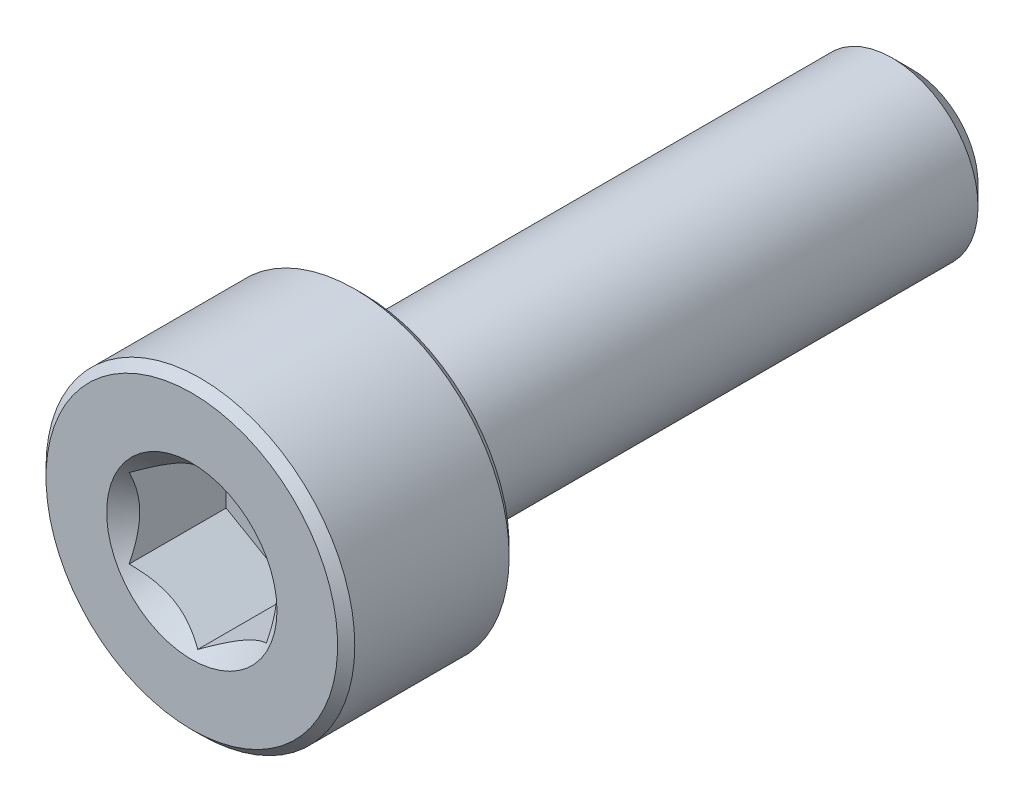
ISO-10303-21;
HEADER;
FILE_DESCRIPTION(('STEP AP214'),'2;1');
FILE_NAME('part.step','',(''),(''),'','','');
FILE_SCHEMA(('AUTOMOTIVE_DESIGN { 1 0 10303 214 1 1 1 1 }'));
ENDSEC;
DATA;
#1=APPLICATION_CONTEXT('core data for automotive mechanical design processes');
#2=APPLICATION_PROTOCOL_DEFINITION('international standard','automotive_design',2000,#1);
#3=PRODUCT_CONTEXT('',#1,'mechanical');
#4=PRODUCT('Part','Part','',(#3));
#5=PRODUCT_RELATED_PRODUCT_CATEGORY('part','',(#4));
#6=PRODUCT_DEFINITION_FORMATION('','',#4);
#7=PRODUCT_DEFINITION_CONTEXT('part definition',#1,'design');
#8=PRODUCT_DEFINITION('design','',#6,#7);
#9=PRODUCT_DEFINITION_SHAPE('','',#8);
#10=(LENGTH_UNIT() NAMED_UNIT(*) SI_UNIT(.MILLI.,.METRE.));
#11=(NAMED_UNIT(*) PLANE_ANGLE_UNIT() SI_UNIT($,.RADIAN.));
#12=(NAMED_UNIT(*) SI_UNIT($,.STERADIAN.) SOLID_ANGLE_UNIT());
#13=UNCERTAINTY_MEASURE_WITH_UNIT(LENGTH_MEASURE(1.E-05),#10,'distance_accuracy_value','');
#14=(GEOMETRIC_REPRESENTATION_CONTEXT(3) GLOBAL_UNCERTAINTY_ASSIGNED_CONTEXT((#13)) GLOBAL_UNIT_ASSIGNED_CONTEXT((#10,
#11,#12)) REPRESENTATION_CONTEXT('',''));
#15=CARTESIAN_POINT('',(0.,0.,0.));
#16=DIRECTION('',(0.,0.,1.));
#17=DIRECTION('',(1.,0.,0.));
#18=AXIS2_PLACEMENT_3D('',#15,#16,#17);
#19=CARTESIAN_POINT('',(0.,0.,2.625));
#20=DIRECTION('',(0.,0.,-1.));
#21=DIRECTION('',(0.,1.,0.));
#22=AXIS2_PLACEMENT_3D('',#19,#20,#21);
#23=TOROIDAL_SURFACE('',#22,1.375,0.125);
#24=CARTESIAN_POINT('',(0.,0.,2.75));
#25=DIRECTION('',(0.,0.,-1.));
#26=DIRECTION('',(0.,1.,0.));
#27=AXIS2_PLACEMENT_3D('',#24,#25,#26);
#28=CIRCLE('',#27,1.375);
#29=CARTESIAN_POINT('',(0.,1.375,2.75));
#30=VERTEX_POINT('',#29);
#31=EDGE_CURVE('E247',#30,#30,#28,.T.);
#32=ORIENTED_EDGE('',*,*,#31,.T.);
#33=EDGE_LOOP('',(#32));
#34=FACE_BOUND('',#33,.T.);
#35=CARTESIAN_POINT('',(0.,0.,2.625));
#36=DIRECTION('',(0.,0.,-1.));
#37=DIRECTION('',(0.,1.,0.));
#38=AXIS2_PLACEMENT_3D('',#35,#36,#37);
#39=CIRCLE('',#38,1.25);
#40=CARTESIAN_POINT('',(0.,1.25,2.625));
#41=VERTEX_POINT('',#40);
#42=EDGE_CURVE('E55',#41,#41,#39,.T.);
#43=ORIENTED_EDGE('',*,*,#42,.F.);
#44=EDGE_LOOP('',(#43));
#45=FACE_BOUND('',#44,.T.);
#46=ADVANCED_FACE('F50',(#34,#45),#23,.F.);
#47=CARTESIAN_POINT('',(0.,2.125,2.75));
#48=DIRECTION('',(0.,0.,-1.));
#49=DIRECTION('',(0.,1.,0.));
#50=AXIS2_PLACEMENT_3D('',#47,#48,#49);
#51=PLANE('',#50);
#52=CARTESIAN_POINT('',(0.,0.,2.75));
#53=DIRECTION('',(0.,0.,-1.));
#54=DIRECTION('',(0.,1.,0.));
#55=AXIS2_PLACEMENT_3D('',#52,#53,#54);
#56=CIRCLE('',#55,2.125);
#57=CARTESIAN_POINT('',(0.,2.125,2.75));
#58=VERTEX_POINT('',#57);
#59=EDGE_CURVE('E249',#58,#58,#56,.T.);
#60=ORIENTED_EDGE('',*,*,#59,.T.);
#61=EDGE_LOOP('',(#60));
#62=FACE_BOUND('',#61,.T.);
#63=ORIENTED_EDGE('',*,*,#31,.F.);
#64=EDGE_LOOP('',(#63));
#65=FACE_BOUND('',#64,.T.);
#66=ADVANCED_FACE('F117',(#62,#65),#51,.T.);
#67=CARTESIAN_POINT('',(0.,0.,2.75));
#68=DIRECTION('',(0.,0.,1.));
#69=DIRECTION('',(0.,-1.,0.));
#70=AXIS2_PLACEMENT_3D('',#67,#68,#69);
#71=CONICAL_SURFACE('',#70,2.125,0.78539816339745);
#72=CARTESIAN_POINT('',(0.,0.,2.875));
#73=DIRECTION('',(0.,0.,-1.));
#74=DIRECTION('',(0.,1.,0.));
#75=AXIS2_PLACEMENT_3D('',#72,#73,#74);
#76=CIRCLE('',#75,2.25);
#77=CARTESIAN_POINT('',(0.,2.25,2.875));
#78=VERTEX_POINT('',#77);
#79=EDGE_CURVE('E258',#78,#78,#76,.T.);
#80=ORIENTED_EDGE('',*,*,#79,.T.);
#81=EDGE_LOOP('',(#80));
#82=FACE_BOUND('',#81,.T.);
#83=ORIENTED_EDGE('',*,*,#59,.F.);
#84=EDGE_LOOP('',(#83));
#85=FACE_BOUND('',#84,.T.);
#86=ADVANCED_FACE('F122',(#82,#85),#71,.T.);
#87=CARTESIAN_POINT('',(0.,0.,-5.25));
#88=DIRECTION('',(0.,0.,-1.));
#89=DIRECTION('',(0.,1.,0.));
#90=AXIS2_PLACEMENT_3D('',#87,#88,#89);
#91=CYLINDRICAL_SURFACE('',#90,2.25);
#92=CARTESIAN_POINT('',(0.,0.,5.125));
#93=DIRECTION('',(0.,0.,-1.));
#94=DIRECTION('',(0.,1.,0.));
#95=AXIS2_PLACEMENT_3D('',#92,#93,#94);
#96=CIRCLE('',#95,2.25);
#97=CARTESIAN_POINT('',(0.,2.25,5.125));
#98=VERTEX_POINT('',#97);
#99=EDGE_CURVE('E237',#98,#98,#96,.T.);
#100=ORIENTED_EDGE('',*,*,#99,.T.);
#101=EDGE_LOOP('',(#100));
#102=FACE_BOUND('',#101,.T.);
#103=ORIENTED_EDGE('',*,*,#79,.F.);
#104=EDGE_LOOP('',(#103));
#105=FACE_BOUND('',#104,.T.);
#106=ADVANCED_FACE('F130',(#102,#105),#91,.T.);
#107=CARTESIAN_POINT('',(0.,0.,5.125));
#108=DIRECTION('',(0.,0.,-1.));
#109=DIRECTION('',(0.,1.,0.));
#110=AXIS2_PLACEMENT_3D('',#107,#108,#109);
#111=CONICAL_SURFACE('',#110,2.25,0.78539816339745);
#112=CARTESIAN_POINT('',(0.,0.,5.25));
#113=DIRECTION('',(0.,0.,-1.));
#114=DIRECTION('',(0.,1.,0.));
#115=AXIS2_PLACEMENT_3D('',#112,#113,#114);
#116=CIRCLE('',#115,2.125);
#117=CARTESIAN_POINT('',(0.,2.125,5.25));
#118=VERTEX_POINT('',#117);
#119=EDGE_CURVE('E234',#118,#118,#116,.T.);
#120=ORIENTED_EDGE('',*,*,#119,.T.);
#121=EDGE_LOOP('',(#120));
#122=FACE_BOUND('',#121,.T.);
#123=ORIENTED_EDGE('',*,*,#99,.F.);
#124=EDGE_LOOP('',(#123));
#125=FACE_BOUND('',#124,.T.);
#126=ADVANCED_FACE('F134',(#122,#125),#111,.T.);
#127=CARTESIAN_POINT('',(0.,0.,5.25));
#128=DIRECTION('',(0.,0.,1.));
#129=DIRECTION('',(0.,-1.,0.));
#130=AXIS2_PLACEMENT_3D('',#127,#128,#129);
#131=PLANE('',#130);
#132=CARTESIAN_POINT('',(0.,0.,5.25));
#133=DIRECTION('',(0.,0.,1.));
#134=DIRECTION('',(1.,0.,0.));
#135=AXIS2_PLACEMENT_3D('',#132,#133,#134);
#136=CIRCLE('',#135,1.2413030787577);
#137=CARTESIAN_POINT('',(1.2413030787577,0.,5.25));
#138=VERTEX_POINT('',#137);
#139=EDGE_CURVE('E12',#138,#138,#136,.T.);
#140=ORIENTED_EDGE('',*,*,#139,.F.);
#141=EDGE_LOOP('',(#140));
#142=FACE_BOUND('',#141,.T.);
#143=ORIENTED_EDGE('',*,*,#119,.F.);
#144=EDGE_LOOP('',(#143));
#145=FACE_BOUND('',#144,.T.);
#146=ADVANCED_FACE('F138',(#142,#145),#131,.T.);
#147=CARTESIAN_POINT('',(0.,0.,5.25));
#148=DIRECTION('',(0.,0.,1.));
#149=DIRECTION('',(1.,0.,0.));
#150=AXIS2_PLACEMENT_3D('',#147,#148,#149);
#151=CONICAL_SURFACE('',#150,1.2413030787577,0.78539816339745);
#152=ORIENTED_EDGE('',*,*,#139,.T.);
#153=EDGE_LOOP('',(#152));
#154=FACE_BOUND('',#153,.T.);
#155=CARTESIAN_POINT('',(-0.000199999999999619,-1.15481600843309,5.16351294699417));
#156=CARTESIAN_POINT('',(0.0341825950071808,-1.13496520795026,5.14367539044729));
#157=CARTESIAN_POINT('',(0.0691401181398248,-1.11478247255942,5.12500248026044));
#158=CARTESIAN_POINT('',(0.14042280295609,-1.07362739529219,5.09081220234471));
#159=CARTESIAN_POINT('',(0.176754750528984,-1.0526511355808,5.07531386864501));
#160=CARTESIAN_POINT('',(0.250016613803311,-1.01035337909803,5.04876476676382));
#161=CARTESIAN_POINT('',(0.286927851445415,-0.989042666109241,5.03764723361848));
#162=CARTESIAN_POINT('',(0.361562729310859,-0.945952199282691,5.02051732539774));
#163=CARTESIAN_POINT('',(0.399284088108636,-0.924173762626596,5.01449215708823));
#164=CARTESIAN_POINT('',(0.464292198417934,-0.886641312640014,5.00905801458905));
#165=CARTESIAN_POINT('',(0.491494371528172,-0.870936130672275,5.00825439793829));
#166=CARTESIAN_POINT('',(0.545846040669112,-0.839556179862848,5.00960415903844));
#167=CARTESIAN_POINT('',(0.572995523754876,-0.823881418494923,5.01175818916875));
#168=CARTESIAN_POINT('',(0.65405627732696,-0.777080970599367,5.02251443175003));
#169=CARTESIAN_POINT('',(0.707564140978428,-0.74618819111643,5.03541201603691));
#170=CARTESIAN_POINT('',(0.801476065143432,-0.691968116419649,5.06653819022373));
#171=CARTESIAN_POINT('',(0.842320523671835,-0.668386557293371,5.08313525732339));
#172=CARTESIAN_POINT('',(0.922409637381944,-0.622147085933681,5.12052238430685));
#173=CARTESIAN_POINT('',(0.961659010870438,-0.599486449584575,5.14129880143896));
#174=CARTESIAN_POINT('',(1.0002,-0.577234799135787,5.16351294699417));
#175=B_SPLINE_CURVE_WITH_KNOTS('',3,(#155,#156,#157,#158,#159,#160,#161,#162,#163,#164,#165,
#166,#167,#168,#169,#170,#171,#172,#173,#174),.UNSPECIFIED.,.F.,.F.,(4,2,2,2,2,2,2,2,2,4),(0.,
0.133237676828559,0.26725222983449,0.3991370762693,0.530689603280768,0.624814864263846,
0.718960890149133,0.907306626112097,1.05710100361789,1.20641411519286),.UNSPECIFIED.);
#176=CARTESIAN_POINT('',(0.,-1.15470053837925,5.16339745962156));
#177=VERTEX_POINT('',#176);
#178=CARTESIAN_POINT('',(1.,-0.577350269189626,5.16339745962156));
#179=VERTEX_POINT('',#178);
#180=EDGE_CURVE('E67',#177,#179,#175,.T.);
#181=ORIENTED_EDGE('',*,*,#180,.F.);
#182=CARTESIAN_POINT('',(-1.0002,-0.577234799135788,5.16351294699417));
#183=CARTESIAN_POINT('',(-0.965817404992819,-0.597085599618622,5.14367539044729));
#184=CARTESIAN_POINT('',(-0.930859881860175,-0.617268335009456,5.12500248026045));
#185=CARTESIAN_POINT('',(-0.85957719704391,-0.658423412276686,5.09081220234471));
#186=CARTESIAN_POINT('',(-0.823245249471016,-0.67939967198808,5.07531386864501));
#187=CARTESIAN_POINT('',(-0.749983386196689,-0.721697428470846,5.04876476676382));
#188=CARTESIAN_POINT('',(-0.713072148554585,-0.743008141459637,5.03764723361848));
#189=CARTESIAN_POINT('',(-0.638437270689141,-0.786098608286186,5.02051732539774));
#190=CARTESIAN_POINT('',(-0.600715911891364,-0.807877044942281,5.01449215708823));
#191=CARTESIAN_POINT('',(-0.535707801582066,-0.845409494928863,5.00905801458905));
#192=CARTESIAN_POINT('',(-0.508505628471827,-0.861114676896602,5.00825439793829));
#193=CARTESIAN_POINT('',(-0.454153959330887,-0.892494627706029,5.00960415903844));
#194=CARTESIAN_POINT('',(-0.427004476245124,-0.908169389073954,5.01175818916875));
#195=CARTESIAN_POINT('',(-0.345943722673039,-0.954969836969511,5.02251443175003));
#196=CARTESIAN_POINT('',(-0.292435859021572,-0.985862616452447,5.03541201603691));
#197=CARTESIAN_POINT('',(-0.198523934856568,-1.04008269114923,5.06653819022373));
#198=CARTESIAN_POINT('',(-0.157679476328165,-1.06366425027551,5.08313525732339));
#199=CARTESIAN_POINT('',(-0.0775903626180557,-1.1099037216352,5.12052238430685));
#200=CARTESIAN_POINT('',(-0.0383409891295617,-1.1325643579843,5.14129880143896));
#201=CARTESIAN_POINT('',(0.000200000000000583,-1.15481600843309,5.16351294699417));
#202=B_SPLINE_CURVE_WITH_KNOTS('',3,(#182,#183,#184,#185,#186,#187,#188,#189,#190,#191,#192,
#193,#194,#195,#196,#197,#198,#199,#200,#201),.UNSPECIFIED.,.F.,.F.,(4,2,2,2,2,2,2,2,2,4),(0.,
0.133237676828559,0.267252229834491,0.3991370762693,0.530689603280769,0.624814864263847,
0.718960890149134,0.907306626112098,1.05710100361789,1.20641411519286),.UNSPECIFIED.);
#203=CARTESIAN_POINT('',(-1.,-0.577350269189626,5.16339745962156));
#204=VERTEX_POINT('',#203);
#205=EDGE_CURVE('E60',#204,#177,#202,.T.);
#206=ORIENTED_EDGE('',*,*,#205,.F.);
#207=CARTESIAN_POINT('',(-1.,-1.21199087789934,5.57997725527287));
#208=CARTESIAN_POINT('',(-1.,-1.18273650300522,5.55741554693661));
#209=CARTESIAN_POINT('',(-1.,-1.15332592158341,5.53505703381193));
#210=CARTESIAN_POINT('',(-1.,-1.09412680336146,5.4908320719692));
#211=CARTESIAN_POINT('',(-1.,-1.06433818018075,5.46896573899681));
#212=CARTESIAN_POINT('',(-1.,-0.973871293541519,5.4039212875776));
#213=CARTESIAN_POINT('',(-1.,-0.912535008128867,5.3616436137258));
#214=CARTESIAN_POINT('',(-1.,-0.783508251342875,5.27806824785001));
#215=CARTESIAN_POINT('',(-1.,-0.715662620346606,5.23700761033256));
#216=CARTESIAN_POINT('',(-1.,-0.576509894905891,5.16150147066944));
#217=CARTESIAN_POINT('',(-1.,-0.505215555513882,5.12703362621591));
#218=CARTESIAN_POINT('',(-1.,-0.398764046939012,5.08484878246325));
#219=CARTESIAN_POINT('',(-1.,-0.365313297980422,5.07284938948254));
#220=CARTESIAN_POINT('',(-1.,-0.297551245132093,5.05153030995285));
#221=CARTESIAN_POINT('',(-1.,-0.263239887100777,5.04221079245894));
#222=CARTESIAN_POINT('',(-1.,-0.194571067470056,5.02691167587498));
#223=CARTESIAN_POINT('',(-1.,-0.160227555987668,5.02087048308474));
#224=CARTESIAN_POINT('',(-1.,-0.0910948269867767,5.01225224503757));
#225=CARTESIAN_POINT('',(-1.,-0.0563055613802757,5.009675576765));
#226=CARTESIAN_POINT('',(-1.,0.0117927152654021,5.00821295512037));
#227=CARTESIAN_POINT('',(-1.,0.0450983170825076,5.00916703835344));
#228=CARTESIAN_POINT('',(-1.,0.111441413420384,5.01434362211099));
#229=CARTESIAN_POINT('',(-1.,0.144478971732107,5.01856532046785));
#230=CARTESIAN_POINT('',(-1.,0.210624763290573,5.03010847896862));
#231=CARTESIAN_POINT('',(-1.,0.243723154740698,5.03748543479042));
#232=CARTESIAN_POINT('',(-1.,0.309187738497536,5.05492899920948));
#233=CARTESIAN_POINT('',(-1.,0.341553969590706,5.06499546496534));
#234=CARTESIAN_POINT('',(-1.,0.440875348086756,5.09974257065232));
#235=CARTESIAN_POINT('',(-1.,0.506480526276306,5.1282699754181));
#236=CARTESIAN_POINT('',(-1.,0.634628446237199,5.19175922476326));
#237=CARTESIAN_POINT('',(-1.,0.697159414671816,5.22674368431451));
#238=CARTESIAN_POINT('',(-1.,0.816694357126197,5.29898555821879));
#239=CARTESIAN_POINT('',(-1.,0.873818851530727,5.33604607035742));
#240=CARTESIAN_POINT('',(-1.,0.957979712513754,5.39336695643995));
#241=CARTESIAN_POINT('',(-1.,0.985671461150835,5.41268175945423));
#242=CARTESIAN_POINT('',(-1.,1.0406749612098,5.45182989264588));
#243=CARTESIAN_POINT('',(-1.,1.06798681474316,5.47166307919343));
#244=CARTESIAN_POINT('',(-1.,1.09514019811391,5.49171143685736));
#245=B_SPLINE_CURVE_WITH_KNOTS('',3,(#207,#208,#209,#210,#211,#212,#213,#214,#215,#216,#217,
#218,#219,#220,#221,#222,#223,#224,#225,#226,#227,#228,#229,#230,#231,#232,#233,#234,#235,#236,
#237,#238,#239,#240,#241,#242,#243,#244),.UNSPECIFIED.,.F.,.F.,(4,2,2,2,2,2,2,2,2,2,2,2,2,2,2,2,
2,2,4),(0.,0.110828944200308,0.221683685263867,0.445078388583645,0.682811068621037,
0.919723239940847,1.02624790401867,1.13277928653702,1.23723298361624,1.34169804566787,
1.44148938783186,1.54125623996228,1.64285505347063,1.74444847208079,1.95844200767913,
2.17319976124347,2.3773768581412,2.47865984803709,2.57991506662171),.UNSPECIFIED.);
#246=CARTESIAN_POINT('',(-1.,0.577350269189625,5.16339745962156));
#247=VERTEX_POINT('',#246);
#248=EDGE_CURVE('E176',#247,#204,#245,.F.);
#249=ORIENTED_EDGE('',*,*,#248,.F.);
#250=CARTESIAN_POINT('',(0.000199999999999743,1.15481600843309,5.16351294699417));
#251=CARTESIAN_POINT('',(-0.0341825950071808,1.13496520795026,5.14367539044729));
#252=CARTESIAN_POINT('',(-0.0691401181398251,1.11478247255942,5.12500248026044));
#253=CARTESIAN_POINT('',(-0.14042280295609,1.07362739529219,5.09081220234471));
#254=CARTESIAN_POINT('',(-0.176754750528985,1.0526511355808,5.07531386864501));
#255=CARTESIAN_POINT('',(-0.250016613803312,1.01035337909803,5.04876476676382));
#256=CARTESIAN_POINT('',(-0.286927851445415,0.989042666109241,5.03764723361848));
#257=CARTESIAN_POINT('',(-0.361562729310859,0.945952199282691,5.02051732539774));
#258=CARTESIAN_POINT('',(-0.399284088108636,0.924173762626596,5.01449215708823));
#259=CARTESIAN_POINT('',(-0.464292198417934,0.886641312640014,5.00905801458905));
#260=CARTESIAN_POINT('',(-0.491494371528172,0.870936130672275,5.00825439793829));
#261=CARTESIAN_POINT('',(-0.545846040669112,0.839556179862848,5.00960415903844));
#262=CARTESIAN_POINT('',(-0.572995523754876,0.823881418494924,5.01175818916875));
#263=CARTESIAN_POINT('',(-0.65405627732696,0.777080970599367,5.02251443175003));
#264=CARTESIAN_POINT('',(-0.707564140978427,0.74618819111643,5.03541201603691));
#265=CARTESIAN_POINT('',(-0.801476065143432,0.691968116419649,5.06653819022373));
#266=CARTESIAN_POINT('',(-0.842320523671834,0.668386557293371,5.08313525732339));
#267=CARTESIAN_POINT('',(-0.922409637381944,0.622147085933681,5.12052238430685));
#268=CARTESIAN_POINT('',(-0.961659010870438,0.599486449584575,5.14129880143896));
#269=CARTESIAN_POINT('',(-1.0002,0.577234799135788,5.16351294699417));
#270=B_SPLINE_CURVE_WITH_KNOTS('',3,(#250,#251,#252,#253,#254,#255,#256,#257,#258,#259,#260,
#261,#262,#263,#264,#265,#266,#267,#268,#269),.UNSPECIFIED.,.F.,.F.,(4,2,2,2,2,2,2,2,2,4),(0.,
0.13323767682856,0.267252229834491,0.399137076269301,0.530689603280768,0.624814864263846,
0.718960890149133,0.907306626112098,1.05710100361789,1.20641411519286),.UNSPECIFIED.);
#271=CARTESIAN_POINT('',(0.,1.15470053837925,5.16339745962156));
#272=VERTEX_POINT('',#271);
#273=EDGE_CURVE('E169',#272,#247,#270,.T.);
#274=ORIENTED_EDGE('',*,*,#273,.F.);
#275=CARTESIAN_POINT('',(1.0002,0.577234799135788,5.16351294699417));
#276=CARTESIAN_POINT('',(0.965817404992819,0.597085599618622,5.14367539044729));
#277=CARTESIAN_POINT('',(0.930859881860175,0.617268335009456,5.12500248026045));
#278=CARTESIAN_POINT('',(0.85957719704391,0.658423412276686,5.09081220234471));
#279=CARTESIAN_POINT('',(0.823245249471016,0.67939967198808,5.07531386864501));
#280=CARTESIAN_POINT('',(0.749983386196689,0.721697428470846,5.04876476676382));
#281=CARTESIAN_POINT('',(0.713072148554585,0.743008141459637,5.03764723361848));
#282=CARTESIAN_POINT('',(0.638437270689141,0.786098608286186,5.02051732539774));
#283=CARTESIAN_POINT('',(0.600715911891364,0.807877044942281,5.01449215708823));
#284=CARTESIAN_POINT('',(0.535707801582066,0.845409494928863,5.00905801458905));
#285=CARTESIAN_POINT('',(0.508505628471827,0.861114676896602,5.00825439793829));
#286=CARTESIAN_POINT('',(0.454153959330887,0.892494627706029,5.00960415903844));
#287=CARTESIAN_POINT('',(0.427004476245124,0.908169389073954,5.01175818916875));
#288=CARTESIAN_POINT('',(0.345943722673039,0.954969836969511,5.02251443175003));
#289=CARTESIAN_POINT('',(0.292435859021572,0.985862616452447,5.03541201603691));
#290=CARTESIAN_POINT('',(0.198523934856568,1.04008269114923,5.06653819022373));
#291=CARTESIAN_POINT('',(0.157679476328165,1.06366425027551,5.08313525732339));
#292=CARTESIAN_POINT('',(0.0775903626180557,1.1099037216352,5.12052238430685));
#293=CARTESIAN_POINT('',(0.0383409891295617,1.1325643579843,5.14129880143896));
#294=CARTESIAN_POINT('',(-0.00020000000000048,1.15481600843309,5.16351294699417));
#295=B_SPLINE_CURVE_WITH_KNOTS('',3,(#275,#276,#277,#278,#279,#280,#281,#282,#283,#284,#285,
#286,#287,#288,#289,#290,#291,#292,#293,#294),.UNSPECIFIED.,.F.,.F.,(4,2,2,2,2,2,2,2,2,4),(0.,
0.133237676828559,0.267252229834491,0.3991370762693,0.530689603280769,0.624814864263847,
0.718960890149134,0.907306626112098,1.05710100361789,1.20641411519286),.UNSPECIFIED.);
#296=CARTESIAN_POINT('',(1.,0.577350269189626,5.16339745962156));
#297=VERTEX_POINT('',#296);
#298=EDGE_CURVE('E160',#297,#272,#295,.T.);
#299=ORIENTED_EDGE('',*,*,#298,.F.);
#300=CARTESIAN_POINT('',(1.,-1.21199087789934,5.57997725527287));
#301=CARTESIAN_POINT('',(1.,-1.18273650300521,5.55741554693661));
#302=CARTESIAN_POINT('',(1.,-1.15332592158341,5.53505703381193));
#303=CARTESIAN_POINT('',(1.,-1.09412680336146,5.4908320719692));
#304=CARTESIAN_POINT('',(1.,-1.06433818018075,5.46896573899681));
#305=CARTESIAN_POINT('',(1.,-0.973871293541519,5.4039212875776));
#306=CARTESIAN_POINT('',(1.,-0.912535008128866,5.3616436137258));
#307=CARTESIAN_POINT('',(1.,-0.783508251342875,5.27806824785001));
#308=CARTESIAN_POINT('',(1.,-0.715662620346606,5.23700761033256));
#309=CARTESIAN_POINT('',(1.,-0.576509894905891,5.16150147066944));
#310=CARTESIAN_POINT('',(1.,-0.505215555513883,5.12703362621591));
#311=CARTESIAN_POINT('',(1.,-0.398764046939012,5.08484878246325));
#312=CARTESIAN_POINT('',(1.,-0.365313297980423,5.07284938948254));
#313=CARTESIAN_POINT('',(1.,-0.297551245132093,5.05153030995285));
#314=CARTESIAN_POINT('',(1.,-0.263239887100777,5.04221079245894));
#315=CARTESIAN_POINT('',(1.,-0.194571067470056,5.02691167587498));
#316=CARTESIAN_POINT('',(1.,-0.160227555987667,5.02087048308474));
#317=CARTESIAN_POINT('',(1.,-0.0910948269867763,5.01225224503757));
#318=CARTESIAN_POINT('',(1.,-0.0563055613802753,5.009675576765));
#319=CARTESIAN_POINT('',(1.,0.0117927152654025,5.00821295512037));
#320=CARTESIAN_POINT('',(1.,0.045098317082508,5.00916703835344));
#321=CARTESIAN_POINT('',(1.,0.111441413420384,5.01434362211099));
#322=CARTESIAN_POINT('',(1.,0.144478971732107,5.01856532046785));
#323=CARTESIAN_POINT('',(1.,0.210624763290573,5.03010847896862));
#324=CARTESIAN_POINT('',(1.,0.243723154740699,5.03748543479042));
#325=CARTESIAN_POINT('',(1.,0.309187738497536,5.05492899920948));
#326=CARTESIAN_POINT('',(1.,0.341553969590707,5.06499546496534));
#327=CARTESIAN_POINT('',(1.,0.440875348086756,5.09974257065232));
#328=CARTESIAN_POINT('',(1.,0.506480526276306,5.1282699754181));
#329=CARTESIAN_POINT('',(1.,0.6346284462372,5.19175922476326));
#330=CARTESIAN_POINT('',(1.,0.697159414671817,5.22674368431451));
#331=CARTESIAN_POINT('',(1.,0.816694357126198,5.29898555821879));
#332=CARTESIAN_POINT('',(1.,0.873818851530728,5.33604607035742));
#333=CARTESIAN_POINT('',(1.,0.957979712513755,5.39336695643995));
#334=CARTESIAN_POINT('',(1.,0.985671461150836,5.41268175945423));
#335=CARTESIAN_POINT('',(1.,1.04067496120981,5.45182989264588));
#336=CARTESIAN_POINT('',(1.,1.06798681474316,5.47166307919343));
#337=CARTESIAN_POINT('',(1.,1.09514019811391,5.49171143685736));
#338=B_SPLINE_CURVE_WITH_KNOTS('',3,(#300,#301,#302,#303,#304,#305,#306,#307,#308,#309,#310,
#311,#312,#313,#314,#315,#316,#317,#318,#319,#320,#321,#322,#323,#324,#325,#326,#327,#328,#329,
#330,#331,#332,#333,#334,#335,#336,#337),.UNSPECIFIED.,.F.,.F.,(4,2,2,2,2,2,2,2,2,2,2,2,2,2,2,2,
2,2,4),(0.,0.110828944200308,0.221683685263867,0.445078388583644,0.682811068621036,
0.919723239940846,1.02624790401867,1.13277928653702,1.23723298361624,1.34169804566787,
1.44148938783186,1.54125623996228,1.64285505347063,1.74444847208079,1.95844200767913,
2.17319976124347,2.3773768581412,2.47865984803709,2.57991506662171),.UNSPECIFIED.);
#339=EDGE_CURVE('E152',#179,#297,#338,.T.);
#340=ORIENTED_EDGE('',*,*,#339,.F.);
#341=EDGE_LOOP('',(#181,#206,#249,#274,#299,#340));
#342=FACE_BOUND('',#341,.T.);
#343=ADVANCED_FACE('F52',(#154,#342),#151,.F.);
#344=CARTESIAN_POINT('',(0.,2.125,3.75));
#345=DIRECTION('',(0.,0.,-1.));
#346=DIRECTION('',(0.,1.,0.));
#347=AXIS2_PLACEMENT_3D('',#344,#345,#346);
#348=PLANE('',#347);
#349=DIRECTION('',(0.866025403784438,0.5,0.));
#350=VECTOR('',#349,1.);
#351=CARTESIAN_POINT('',(0.,-1.15470053837925,3.75));
#352=LINE('',#351,#350);
#353=CARTESIAN_POINT('',(0.,-1.15470053837925,3.75));
#354=VERTEX_POINT('',#353);
#355=CARTESIAN_POINT('',(1.,-0.577350269189626,3.75));
#356=VERTEX_POINT('',#355);
#357=EDGE_CURVE('E221',#354,#356,#352,.T.);
#358=ORIENTED_EDGE('',*,*,#357,.T.);
#359=DIRECTION('',(0.,1.,0.));
#360=VECTOR('',#359,1.);
#361=CARTESIAN_POINT('',(1.,-0.577350269189626,3.75));
#362=LINE('',#361,#360);
#363=CARTESIAN_POINT('',(1.,0.577350269189626,3.75));
#364=VERTEX_POINT('',#363);
#365=EDGE_CURVE('E161',#356,#364,#362,.T.);
#366=ORIENTED_EDGE('',*,*,#365,.T.);
#367=DIRECTION('',(-0.866025403784439,0.5,0.));
#368=VECTOR('',#367,1.);
#369=CARTESIAN_POINT('',(1.,0.577350269189626,3.75));
#370=LINE('',#369,#368);
#371=CARTESIAN_POINT('',(0.,1.15470053837925,3.75));
#372=VERTEX_POINT('',#371);
#373=EDGE_CURVE('E222',#364,#372,#370,.T.);
#374=ORIENTED_EDGE('',*,*,#373,.T.);
#375=DIRECTION('',(-0.866025403784438,-0.5,0.));
#376=VECTOR('',#375,1.);
#377=CARTESIAN_POINT('',(0.,1.15470053837925,3.75));
#378=LINE('',#377,#376);
#379=CARTESIAN_POINT('',(-1.,0.577350269189626,3.75));
#380=VERTEX_POINT('',#379);
#381=EDGE_CURVE('E227',#372,#380,#378,.T.);
#382=ORIENTED_EDGE('',*,*,#381,.T.);
#383=DIRECTION('',(0.,-1.,0.));
#384=VECTOR('',#383,1.);
#385=CARTESIAN_POINT('',(-1.,0.577350269189626,3.75));
#386=LINE('',#385,#384);
#387=CARTESIAN_POINT('',(-1.,-0.577350269189626,3.75));
#388=VERTEX_POINT('',#387);
#389=EDGE_CURVE('E212',#380,#388,#386,.T.);
#390=ORIENTED_EDGE('',*,*,#389,.T.);
#391=DIRECTION('',(0.866025403784439,-0.5,0.));
#392=VECTOR('',#391,1.);
#393=CARTESIAN_POINT('',(-1.,-0.577350269189626,3.75));
#394=LINE('',#393,#392);
#395=EDGE_CURVE('E211',#388,#354,#394,.T.);
#396=ORIENTED_EDGE('',*,*,#395,.T.);
#397=EDGE_LOOP('',(#358,#366,#374,#382,#390,#396));
#398=FACE_BOUND('',#397,.T.);
#399=ADVANCED_FACE('F143',(#398),#348,.F.);
#400=CARTESIAN_POINT('',(0.,-1.15470053837925,-0.305050463303895));
#401=DIRECTION('',(0.5,-0.866025403784438,0.));
#402=DIRECTION('',(0.866025403784438,0.5,0.));
#403=AXIS2_PLACEMENT_3D('',#400,#401,#402);
#404=PLANE('',#403);
#405=DIRECTION('',(0.,0.,1.));
#406=VECTOR('',#405,1.);
#407=CARTESIAN_POINT('',(0.,-1.15470053837925,-0.305050463303895));
#408=LINE('',#407,#406);
#409=EDGE_CURVE('E215',#354,#177,#408,.T.);
#410=ORIENTED_EDGE('',*,*,#409,.T.);
#411=ORIENTED_EDGE('',*,*,#180,.T.);
#412=DIRECTION('',(0.,0.,1.));
#413=VECTOR('',#412,1.);
#414=CARTESIAN_POINT('',(1.,-0.577350269189626,-0.305050463303895));
#415=LINE('',#414,#413);
#416=EDGE_CURVE('E230',#356,#179,#415,.T.);
#417=ORIENTED_EDGE('',*,*,#416,.F.);
#418=ORIENTED_EDGE('',*,*,#357,.F.);
#419=EDGE_LOOP('',(#410,#411,#417,#418));
#420=FACE_BOUND('',#419,.T.);
#421=ADVANCED_FACE('F145',(#420),#404,.F.);
#422=CARTESIAN_POINT('',(-1.,-0.577350269189626,-0.305050463303895));
#423=DIRECTION('',(-0.5,-0.866025403784439,0.));
#424=DIRECTION('',(0.866025403784439,-0.5,0.));
#425=AXIS2_PLACEMENT_3D('',#422,#423,#424);
#426=PLANE('',#425);
#427=DIRECTION('',(0.,0.,1.));
#428=VECTOR('',#427,1.);
#429=CARTESIAN_POINT('',(-1.,-0.577350269189626,-0.305050463303895));
#430=LINE('',#429,#428);
#431=EDGE_CURVE('E206',#388,#204,#430,.T.);
#432=ORIENTED_EDGE('',*,*,#431,.T.);
#433=ORIENTED_EDGE('',*,*,#205,.T.);
#434=ORIENTED_EDGE('',*,*,#409,.F.);
#435=ORIENTED_EDGE('',*,*,#395,.F.);
#436=EDGE_LOOP('',(#432,#433,#434,#435));
#437=FACE_BOUND('',#436,.T.);
#438=ADVANCED_FACE('F191',(#437),#426,.F.);
#439=CARTESIAN_POINT('',(-1.,0.577350269189626,-0.305050463303895));
#440=DIRECTION('',(-1.,0.,0.));
#441=DIRECTION('',(0.,0.,1.));
#442=AXIS2_PLACEMENT_3D('',#439,#440,#441);
#443=PLANE('',#442);
#444=DIRECTION('',(0.,0.,1.));
#445=VECTOR('',#444,1.);
#446=CARTESIAN_POINT('',(-1.,0.577350269189626,-0.305050463303895));
#447=LINE('',#446,#445);
#448=EDGE_CURVE('E209',#380,#247,#447,.T.);
#449=ORIENTED_EDGE('',*,*,#448,.T.);
#450=ORIENTED_EDGE('',*,*,#248,.T.);
#451=ORIENTED_EDGE('',*,*,#431,.F.);
#452=ORIENTED_EDGE('',*,*,#389,.F.);
#453=EDGE_LOOP('',(#449,#450,#451,#452));
#454=FACE_BOUND('',#453,.T.);
#455=ADVANCED_FACE('F186',(#454),#443,.F.);
#456=CARTESIAN_POINT('',(0.,1.15470053837925,-0.305050463303895));
#457=DIRECTION('',(-0.5,0.866025403784438,0.));
#458=DIRECTION('',(-0.866025403784438,-0.5,0.));
#459=AXIS2_PLACEMENT_3D('',#456,#457,#458);
#460=PLANE('',#459);
#461=DIRECTION('',(0.,0.,1.));
#462=VECTOR('',#461,1.);
#463=CARTESIAN_POINT('',(0.,1.15470053837925,-0.305050463303895));
#464=LINE('',#463,#462);
#465=EDGE_CURVE('E226',#372,#272,#464,.T.);
#466=ORIENTED_EDGE('',*,*,#465,.T.);
#467=ORIENTED_EDGE('',*,*,#273,.T.);
#468=ORIENTED_EDGE('',*,*,#448,.F.);
#469=ORIENTED_EDGE('',*,*,#381,.F.);
#470=EDGE_LOOP('',(#466,#467,#468,#469));
#471=FACE_BOUND('',#470,.T.);
#472=ADVANCED_FACE('F183',(#471),#460,.F.);
#473=CARTESIAN_POINT('',(1.,0.577350269189626,-0.305050463303895));
#474=DIRECTION('',(0.5,0.866025403784439,0.));
#475=DIRECTION('',(-0.866025403784439,0.5,0.));
#476=AXIS2_PLACEMENT_3D('',#473,#474,#475);
#477=PLANE('',#476);
#478=DIRECTION('',(0.,0.,1.));
#479=VECTOR('',#478,1.);
#480=CARTESIAN_POINT('',(1.,0.577350269189626,-0.305050463303895));
#481=LINE('',#480,#479);
#482=EDGE_CURVE('E225',#364,#297,#481,.T.);
#483=ORIENTED_EDGE('',*,*,#482,.T.);
#484=ORIENTED_EDGE('',*,*,#298,.T.);
#485=ORIENTED_EDGE('',*,*,#465,.F.);
#486=ORIENTED_EDGE('',*,*,#373,.F.);
#487=EDGE_LOOP('',(#483,#484,#485,#486));
#488=FACE_BOUND('',#487,.T.);
#489=ADVANCED_FACE('F111',(#488),#477,.F.);
#490=CARTESIAN_POINT('',(1.,-0.577350269189626,-0.305050463303895));
#491=DIRECTION('',(1.,0.,0.));
#492=DIRECTION('',(0.,0.,-1.));
#493=AXIS2_PLACEMENT_3D('',#490,#491,#492);
#494=PLANE('',#493);
#495=ORIENTED_EDGE('',*,*,#416,.T.);
#496=ORIENTED_EDGE('',*,*,#339,.T.);
#497=ORIENTED_EDGE('',*,*,#482,.F.);
#498=ORIENTED_EDGE('',*,*,#365,.F.);
#499=EDGE_LOOP('',(#495,#496,#497,#498));
#500=FACE_BOUND('',#499,.T.);
#501=ADVANCED_FACE('F105',(#500),#494,.F.);
#502=CARTESIAN_POINT('',(0.,0.,1.90331216351296));
#503=DIRECTION('',(0.,0.,1.));
#504=DIRECTION('',(0.,-1.,0.));
#505=AXIS2_PLACEMENT_3D('',#502,#503,#504);
#506=CONICAL_SURFACE('',#505,0.,1.04719755119659);
#507=ORIENTED_EDGE('',*,*,#42,.T.);
#508=EDGE_LOOP('',(#507));
#509=FACE_BOUND('',#508,.T.);
#510=CARTESIAN_POINT('',(0.,0.,1.90331216351296));
#511=VERTEX_POINT('',#510);
#512=VERTEX_LOOP('',#511);
#513=FACE_BOUND('',#512,.T.);
#514=ADVANCED_FACE('F103',(#509,#513),#506,.T.);
#515=CLOSED_SHELL('',(#46,#66,#86,#106,#126,#146,#343,#399,#421,#438,#455,#472,#489,#501,#514));
#516=MANIFOLD_SOLID_BREP('B2',#515);
#517=CARTESIAN_POINT('',(-2.26,-2.25,2.625));
#518=DIRECTION('',(0.,0.,-1.));
#519=DIRECTION('',(-1.,0.,0.));
#520=AXIS2_PLACEMENT_3D('',#517,#518,#519);
#521=PLANE('',#520);
#522=CARTESIAN_POINT('',(0.,0.,2.625));
#523=DIRECTION('',(0.,0.,-1.));
#524=DIRECTION('',(0.,1.,0.));
#525=AXIS2_PLACEMENT_3D('',#522,#523,#524);
#526=CIRCLE('',#525,1.25);
#527=CARTESIAN_POINT('',(0.,1.25,2.625));
#528=VERTEX_POINT('',#527);
#529=EDGE_CURVE('E384',#528,#528,#526,.T.);
#530=ORIENTED_EDGE('',*,*,#529,.F.);
#531=EDGE_LOOP('',(#530));
#532=FACE_BOUND('',#531,.T.);
#533=ADVANCED_FACE('F374',(#532),#521,.F.);
#534=CARTESIAN_POINT('',(0.,0.957716426222752,-5.25));
#535=DIRECTION('',(0.,0.,-1.));
#536=DIRECTION('',(0.,1.,0.));
#537=AXIS2_PLACEMENT_3D('',#534,#535,#536);
#538=PLANE('',#537);
#539=CARTESIAN_POINT('',(0.,0.,-5.25));
#540=DIRECTION('',(0.,0.,-1.));
#541=DIRECTION('',(0.,1.,0.));
#542=AXIS2_PLACEMENT_3D('',#539,#540,#541);
#543=CIRCLE('',#542,0.957716426222752);
#544=CARTESIAN_POINT('',(0.,0.957716426222752,-5.25));
#545=VERTEX_POINT('',#544);
#546=EDGE_CURVE('E49',#545,#545,#543,.T.);
#547=ORIENTED_EDGE('',*,*,#546,.T.);
#548=EDGE_LOOP('',(#547));
#549=FACE_BOUND('',#548,.T.);
#550=ADVANCED_FACE('F395',(#549),#538,.T.);
#551=CARTESIAN_POINT('',(0.,0.,-5.25));
#552=DIRECTION('',(0.,0.,1.));
#553=DIRECTION('',(0.,-1.,0.));
#554=AXIS2_PLACEMENT_3D('',#551,#552,#553);
#555=CONICAL_SURFACE('',#554,0.957716426222752,0.785398163397447);
#556=CARTESIAN_POINT('',(0.,0.,-4.95771642622275));
#557=DIRECTION('',(0.,0.,-1.));
#558=DIRECTION('',(0.,1.,0.));
#559=AXIS2_PLACEMENT_3D('',#556,#557,#558);
#560=CIRCLE('',#559,1.25);
#561=CARTESIAN_POINT('',(0.,1.25,-4.95771642622275));
#562=VERTEX_POINT('',#561);
#563=EDGE_CURVE('E380',#562,#562,#560,.T.);
#564=ORIENTED_EDGE('',*,*,#563,.T.);
#565=EDGE_LOOP('',(#564));
#566=FACE_BOUND('',#565,.T.);
#567=ORIENTED_EDGE('',*,*,#546,.F.);
#568=EDGE_LOOP('',(#567));
#569=FACE_BOUND('',#568,.T.);
#570=ADVANCED_FACE('F399',(#566,#569),#555,.T.);
#571=CARTESIAN_POINT('',(0.,0.,-5.25));
#572=DIRECTION('',(0.,0.,-1.));
#573=DIRECTION('',(0.,1.,0.));
#574=AXIS2_PLACEMENT_3D('',#571,#572,#573);
#575=CYLINDRICAL_SURFACE('',#574,1.25);
#576=ORIENTED_EDGE('',*,*,#529,.T.);
#577=EDGE_LOOP('',(#576));
#578=FACE_BOUND('',#577,.T.);
#579=ORIENTED_EDGE('',*,*,#563,.F.);
#580=EDGE_LOOP('',(#579));
#581=FACE_BOUND('',#580,.T.);
#582=ADVANCED_FACE('F391',(#578,#581),#575,.T.);
#583=CLOSED_SHELL('',(#533,#550,#570,#582));
#584=MANIFOLD_SOLID_BREP('B6',#583);
#585=ADVANCED_BREP_SHAPE_REPRESENTATION('',(#18,#516,#584),#14);
#586=SHAPE_DEFINITION_REPRESENTATION(#9,#585);
ENDSEC;
END-ISO-10303-21;
